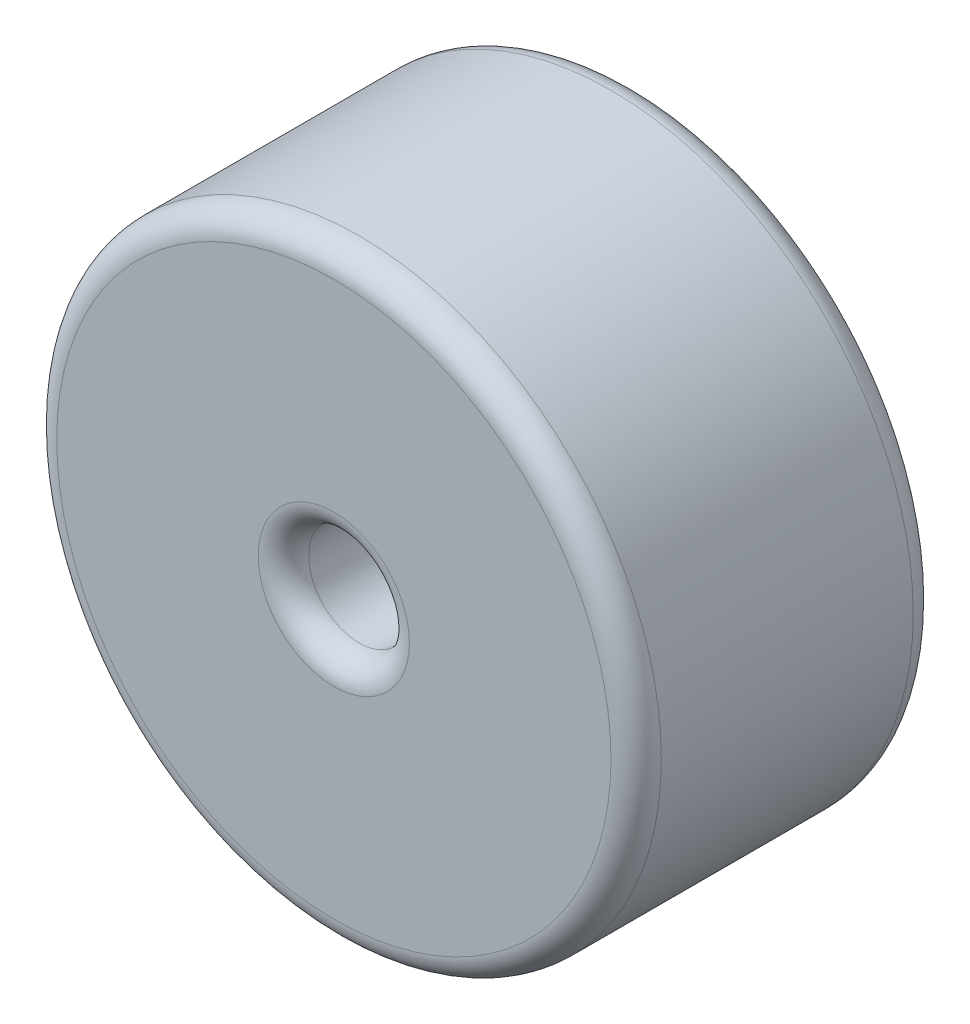
ISO-10303-21;
HEADER;
FILE_DESCRIPTION(('STEP AP214'),'2;1');
FILE_NAME('part.step','',(''),(''),'','','');
FILE_SCHEMA(('AUTOMOTIVE_DESIGN { 1 0 10303 214 1 1 1 1 }'));
ENDSEC;
DATA;
#1=APPLICATION_CONTEXT('core data for automotive mechanical design processes');
#2=APPLICATION_PROTOCOL_DEFINITION('international standard','automotive_design',2000,#1);
#3=PRODUCT_CONTEXT('',#1,'mechanical');
#4=PRODUCT('Part','Part','',(#3));
#5=PRODUCT_RELATED_PRODUCT_CATEGORY('part','',(#4));
#6=PRODUCT_DEFINITION_FORMATION('','',#4);
#7=PRODUCT_DEFINITION_CONTEXT('part definition',#1,'design');
#8=PRODUCT_DEFINITION('design','',#6,#7);
#9=PRODUCT_DEFINITION_SHAPE('','',#8);
#10=(LENGTH_UNIT() NAMED_UNIT(*) SI_UNIT(.MILLI.,.METRE.));
#11=(NAMED_UNIT(*) PLANE_ANGLE_UNIT() SI_UNIT($,.RADIAN.));
#12=(NAMED_UNIT(*) SI_UNIT($,.STERADIAN.) SOLID_ANGLE_UNIT());
#13=UNCERTAINTY_MEASURE_WITH_UNIT(LENGTH_MEASURE(1.E-05),#10,'distance_accuracy_value','');
#14=(GEOMETRIC_REPRESENTATION_CONTEXT(3) GLOBAL_UNCERTAINTY_ASSIGNED_CONTEXT((#13)) GLOBAL_UNIT_ASSIGNED_CONTEXT((#10,
#11,#12)) REPRESENTATION_CONTEXT('',''));
#15=CARTESIAN_POINT('',(0.,0.,0.));
#16=DIRECTION('',(0.,0.,1.));
#17=DIRECTION('',(1.,0.,0.));
#18=AXIS2_PLACEMENT_3D('',#15,#16,#17);
#19=CARTESIAN_POINT('',(0.,0.,12.));
#20=DIRECTION('',(0.,0.,-1.));
#21=DIRECTION('',(-1.,0.,0.));
#22=AXIS2_PLACEMENT_3D('',#19,#20,#21);
#23=CYLINDRICAL_SURFACE('',#22,12.);
#24=CARTESIAN_POINT('',(0.,0.,11.));
#25=DIRECTION('',(0.,0.,1.));
#26=DIRECTION('',(1.,0.,0.));
#27=AXIS2_PLACEMENT_3D('',#24,#25,#26);
#28=CIRCLE('',#27,12.);
#29=CARTESIAN_POINT('',(12.,0.,11.));
#30=VERTEX_POINT('',#29);
#31=EDGE_CURVE('E64',#30,#30,#28,.F.);
#32=ORIENTED_EDGE('',*,*,#31,.T.);
#33=EDGE_LOOP('',(#32));
#34=FACE_BOUND('',#33,.T.);
#35=CARTESIAN_POINT('',(0.,0.,1.));
#36=DIRECTION('',(0.,0.,1.));
#37=DIRECTION('',(1.,0.,0.));
#38=AXIS2_PLACEMENT_3D('',#35,#36,#37);
#39=CIRCLE('',#38,12.);
#40=CARTESIAN_POINT('',(12.,0.,1.));
#41=VERTEX_POINT('',#40);
#42=EDGE_CURVE('E68',#41,#41,#39,.T.);
#43=ORIENTED_EDGE('',*,*,#42,.T.);
#44=EDGE_LOOP('',(#43));
#45=FACE_BOUND('',#44,.T.);
#46=ADVANCED_FACE('F36',(#34,#45),#23,.T.);
#47=CARTESIAN_POINT('',(0.,0.,12.));
#48=DIRECTION('',(0.,0.,1.));
#49=DIRECTION('',(1.,0.,0.));
#50=AXIS2_PLACEMENT_3D('',#47,#48,#49);
#51=PLANE('',#50);
#52=CARTESIAN_POINT('',(0.,0.,12.));
#53=DIRECTION('',(0.,0.,1.));
#54=DIRECTION('',(1.,0.,0.));
#55=AXIS2_PLACEMENT_3D('',#52,#53,#54);
#56=CIRCLE('',#55,3.);
#57=CARTESIAN_POINT('',(3.,0.,12.));
#58=VERTEX_POINT('',#57);
#59=EDGE_CURVE('E54',#58,#58,#56,.F.);
#60=ORIENTED_EDGE('',*,*,#59,.T.);
#61=EDGE_LOOP('',(#60));
#62=FACE_BOUND('',#61,.T.);
#63=CARTESIAN_POINT('',(0.,0.,12.));
#64=DIRECTION('',(0.,0.,1.));
#65=DIRECTION('',(1.,0.,0.));
#66=AXIS2_PLACEMENT_3D('',#63,#64,#65);
#67=CIRCLE('',#66,11.);
#68=CARTESIAN_POINT('',(11.,0.,12.));
#69=VERTEX_POINT('',#68);
#70=EDGE_CURVE('E72',#69,#69,#67,.T.);
#71=ORIENTED_EDGE('',*,*,#70,.T.);
#72=EDGE_LOOP('',(#71));
#73=FACE_BOUND('',#72,.T.);
#74=ADVANCED_FACE('F77',(#62,#73),#51,.T.);
#75=CARTESIAN_POINT('',(0.,0.,0.));
#76=DIRECTION('',(0.,0.,1.));
#77=DIRECTION('',(1.,0.,0.));
#78=AXIS2_PLACEMENT_3D('',#75,#76,#77);
#79=PLANE('',#78);
#80=CARTESIAN_POINT('',(0.,0.,0.));
#81=DIRECTION('',(0.,0.,1.));
#82=DIRECTION('',(1.,0.,0.));
#83=AXIS2_PLACEMENT_3D('',#80,#81,#82);
#84=CIRCLE('',#83,3.);
#85=CARTESIAN_POINT('',(3.,0.,0.));
#86=VERTEX_POINT('',#85);
#87=EDGE_CURVE('E10',#86,#86,#84,.T.);
#88=ORIENTED_EDGE('',*,*,#87,.T.);
#89=EDGE_LOOP('',(#88));
#90=FACE_BOUND('',#89,.T.);
#91=CARTESIAN_POINT('',(0.,0.,0.));
#92=DIRECTION('',(0.,0.,1.));
#93=DIRECTION('',(1.,0.,0.));
#94=AXIS2_PLACEMENT_3D('',#91,#92,#93);
#95=CIRCLE('',#94,11.);
#96=CARTESIAN_POINT('',(11.,0.,0.));
#97=VERTEX_POINT('',#96);
#98=EDGE_CURVE('E60',#97,#97,#95,.F.);
#99=ORIENTED_EDGE('',*,*,#98,.T.);
#100=EDGE_LOOP('',(#99));
#101=FACE_BOUND('',#100,.T.);
#102=ADVANCED_FACE('F82',(#90,#101),#79,.F.);
#103=CARTESIAN_POINT('',(0.,0.,11.));
#104=DIRECTION('',(0.,0.,1.));
#105=DIRECTION('',(1.,0.,0.));
#106=AXIS2_PLACEMENT_3D('',#103,#104,#105);
#107=TOROIDAL_SURFACE('',#106,11.,1.);
#108=ORIENTED_EDGE('',*,*,#31,.F.);
#109=EDGE_LOOP('',(#108));
#110=FACE_BOUND('',#109,.T.);
#111=ORIENTED_EDGE('',*,*,#70,.F.);
#112=EDGE_LOOP('',(#111));
#113=FACE_BOUND('',#112,.T.);
#114=ADVANCED_FACE('F79',(#110,#113),#107,.T.);
#115=CARTESIAN_POINT('',(0.,0.,1.));
#116=DIRECTION('',(0.,0.,1.));
#117=DIRECTION('',(1.,0.,0.));
#118=AXIS2_PLACEMENT_3D('',#115,#116,#117);
#119=TOROIDAL_SURFACE('',#118,11.,1.);
#120=ORIENTED_EDGE('',*,*,#98,.F.);
#121=EDGE_LOOP('',(#120));
#122=FACE_BOUND('',#121,.T.);
#123=ORIENTED_EDGE('',*,*,#42,.F.);
#124=EDGE_LOOP('',(#123));
#125=FACE_BOUND('',#124,.T.);
#126=ADVANCED_FACE('F81',(#122,#125),#119,.T.);
#127=CARTESIAN_POINT('',(0.,0.,12.));
#128=DIRECTION('',(0.,0.,-1.));
#129=DIRECTION('',(-1.,0.,0.));
#130=AXIS2_PLACEMENT_3D('',#127,#128,#129);
#131=CYLINDRICAL_SURFACE('',#130,2.);
#132=CARTESIAN_POINT('',(0.,0.,11.));
#133=DIRECTION('',(0.,0.,1.));
#134=DIRECTION('',(1.,0.,0.));
#135=AXIS2_PLACEMENT_3D('',#132,#133,#134);
#136=CIRCLE('',#135,2.);
#137=CARTESIAN_POINT('',(2.,0.,11.));
#138=VERTEX_POINT('',#137);
#139=EDGE_CURVE('E44',#138,#138,#136,.T.);
#140=ORIENTED_EDGE('',*,*,#139,.T.);
#141=EDGE_LOOP('',(#140));
#142=FACE_BOUND('',#141,.T.);
#143=CARTESIAN_POINT('',(0.,0.,1.));
#144=DIRECTION('',(0.,0.,1.));
#145=DIRECTION('',(1.,0.,0.));
#146=AXIS2_PLACEMENT_3D('',#143,#144,#145);
#147=CIRCLE('',#146,2.);
#148=CARTESIAN_POINT('',(2.,0.,1.));
#149=VERTEX_POINT('',#148);
#150=EDGE_CURVE('E49',#149,#149,#147,.F.);
#151=ORIENTED_EDGE('',*,*,#150,.T.);
#152=EDGE_LOOP('',(#151));
#153=FACE_BOUND('',#152,.T.);
#154=ADVANCED_FACE('F89',(#142,#153),#131,.F.);
#155=CARTESIAN_POINT('',(0.,0.,11.));
#156=DIRECTION('',(0.,0.,1.));
#157=DIRECTION('',(1.,0.,0.));
#158=AXIS2_PLACEMENT_3D('',#155,#156,#157);
#159=TOROIDAL_SURFACE('',#158,3.,1.);
#160=ORIENTED_EDGE('',*,*,#139,.F.);
#161=EDGE_LOOP('',(#160));
#162=FACE_BOUND('',#161,.T.);
#163=ORIENTED_EDGE('',*,*,#59,.F.);
#164=EDGE_LOOP('',(#163));
#165=FACE_BOUND('',#164,.T.);
#166=ADVANCED_FACE('F107',(#162,#165),#159,.T.);
#167=CARTESIAN_POINT('',(0.,0.,1.));
#168=DIRECTION('',(0.,0.,1.));
#169=DIRECTION('',(1.,0.,0.));
#170=AXIS2_PLACEMENT_3D('',#167,#168,#169);
#171=TOROIDAL_SURFACE('',#170,3.,1.);
#172=ORIENTED_EDGE('',*,*,#87,.F.);
#173=EDGE_LOOP('',(#172));
#174=FACE_BOUND('',#173,.T.);
#175=ORIENTED_EDGE('',*,*,#150,.F.);
#176=EDGE_LOOP('',(#175));
#177=FACE_BOUND('',#176,.T.);
#178=ADVANCED_FACE('F38',(#174,#177),#171,.T.);
#179=CLOSED_SHELL('',(#46,#74,#102,#114,#126,#154,#166,#178));
#180=MANIFOLD_SOLID_BREP('B2',#179);
#181=ADVANCED_BREP_SHAPE_REPRESENTATION('',(#18,#180),#14);
#182=SHAPE_DEFINITION_REPRESENTATION(#9,#181);
ENDSEC;
END-ISO-10303-21;
